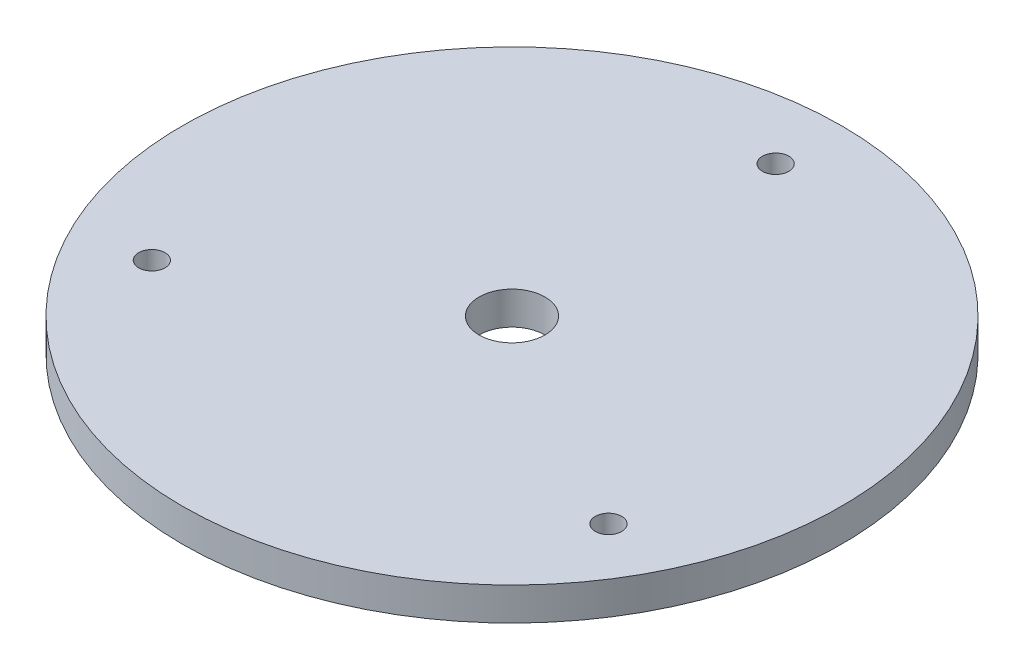
ISO-10303-21;
HEADER;
FILE_DESCRIPTION(('STEP AP214'),'2;1');
FILE_NAME('part.step','',(''),(''),'','','');
FILE_SCHEMA(('AUTOMOTIVE_DESIGN { 1 0 10303 214 1 1 1 1 }'));
ENDSEC;
DATA;
#1=APPLICATION_CONTEXT('core data for automotive mechanical design processes');
#2=APPLICATION_PROTOCOL_DEFINITION('international standard','automotive_design',2000,#1);
#3=PRODUCT_CONTEXT('',#1,'mechanical');
#4=PRODUCT('Part','Part','',(#3));
#5=PRODUCT_RELATED_PRODUCT_CATEGORY('part','',(#4));
#6=PRODUCT_DEFINITION_FORMATION('','',#4);
#7=PRODUCT_DEFINITION_CONTEXT('part definition',#1,'design');
#8=PRODUCT_DEFINITION('design','',#6,#7);
#9=PRODUCT_DEFINITION_SHAPE('','',#8);
#10=(LENGTH_UNIT() NAMED_UNIT(*) SI_UNIT(.MILLI.,.METRE.));
#11=(NAMED_UNIT(*) PLANE_ANGLE_UNIT() SI_UNIT($,.RADIAN.));
#12=(NAMED_UNIT(*) SI_UNIT($,.STERADIAN.) SOLID_ANGLE_UNIT());
#13=UNCERTAINTY_MEASURE_WITH_UNIT(LENGTH_MEASURE(1.E-05),#10,'distance_accuracy_value','');
#14=(GEOMETRIC_REPRESENTATION_CONTEXT(3) GLOBAL_UNCERTAINTY_ASSIGNED_CONTEXT((#13)) GLOBAL_UNIT_ASSIGNED_CONTEXT((#10,
#11,#12)) REPRESENTATION_CONTEXT('',''));
#15=CARTESIAN_POINT('',(0.,0.,0.));
#16=DIRECTION('',(0.,0.,1.));
#17=DIRECTION('',(1.,0.,0.));
#18=AXIS2_PLACEMENT_3D('',#15,#16,#17);
#19=CARTESIAN_POINT('',(0.,10.,0.));
#20=DIRECTION('',(0.,1.,0.));
#21=DIRECTION('',(0.,0.,1.));
#22=AXIS2_PLACEMENT_3D('',#19,#20,#21);
#23=PLANE('',#22);
#24=CARTESIAN_POINT('',(69.2820323027549,10.,40.0000000000003));
#25=DIRECTION('',(0.,1.,0.));
#26=DIRECTION('',(0.,0.,1.));
#27=AXIS2_PLACEMENT_3D('',#24,#25,#26);
#28=CIRCLE('',#27,4.00000000000001);
#29=CARTESIAN_POINT('',(69.2820323027549,10.,44.0000000000003));
#30=VERTEX_POINT('',#29);
#31=EDGE_CURVE('E56',#30,#30,#28,.T.);
#32=ORIENTED_EDGE('',*,*,#31,.F.);
#33=EDGE_LOOP('',(#32));
#34=FACE_BOUND('',#33,.T.);
#35=CARTESIAN_POINT('',(0.,10.,0.));
#36=DIRECTION('',(0.,1.,0.));
#37=DIRECTION('',(0.,0.,1.));
#38=AXIS2_PLACEMENT_3D('',#35,#36,#37);
#39=CIRCLE('',#38,10.);
#40=CARTESIAN_POINT('',(0.,10.,10.));
#41=VERTEX_POINT('',#40);
#42=EDGE_CURVE('E45',#41,#41,#39,.T.);
#43=ORIENTED_EDGE('',*,*,#42,.F.);
#44=EDGE_LOOP('',(#43));
#45=FACE_BOUND('',#44,.T.);
#46=CARTESIAN_POINT('',(0.,10.,0.));
#47=DIRECTION('',(0.,1.,0.));
#48=DIRECTION('',(0.,0.,1.));
#49=AXIS2_PLACEMENT_3D('',#46,#47,#48);
#50=CIRCLE('',#49,100.);
#51=CARTESIAN_POINT('',(0.,10.,100.));
#52=VERTEX_POINT('',#51);
#53=EDGE_CURVE('E10',#52,#52,#50,.T.);
#54=ORIENTED_EDGE('',*,*,#53,.T.);
#55=EDGE_LOOP('',(#54));
#56=FACE_BOUND('',#55,.T.);
#57=CARTESIAN_POINT('',(-69.2820323027552,10.,39.9999999999998));
#58=DIRECTION('',(0.,1.,0.));
#59=DIRECTION('',(0.,0.,1.));
#60=AXIS2_PLACEMENT_3D('',#57,#58,#59);
#61=CIRCLE('',#60,4.);
#62=CARTESIAN_POINT('',(-69.2820323027552,10.,43.9999999999998));
#63=VERTEX_POINT('',#62);
#64=EDGE_CURVE('E50',#63,#63,#61,.T.);
#65=ORIENTED_EDGE('',*,*,#64,.F.);
#66=EDGE_LOOP('',(#65));
#67=FACE_BOUND('',#66,.T.);
#68=CARTESIAN_POINT('',(0.,10.,-80.));
#69=DIRECTION('',(0.,1.,0.));
#70=DIRECTION('',(0.,0.,1.));
#71=AXIS2_PLACEMENT_3D('',#68,#69,#70);
#72=CIRCLE('',#71,4.);
#73=CARTESIAN_POINT('',(0.,10.,-76.));
#74=VERTEX_POINT('',#73);
#75=EDGE_CURVE('E62',#74,#74,#72,.T.);
#76=ORIENTED_EDGE('',*,*,#75,.F.);
#77=EDGE_LOOP('',(#76));
#78=FACE_BOUND('',#77,.T.);
#79=ADVANCED_FACE('F34',(#34,#45,#56,#67,#78),#23,.T.);
#80=CARTESIAN_POINT('',(0.,0.,0.));
#81=DIRECTION('',(0.,1.,0.));
#82=DIRECTION('',(0.,0.,1.));
#83=AXIS2_PLACEMENT_3D('',#80,#81,#82);
#84=PLANE('',#83);
#85=CARTESIAN_POINT('',(69.2820323027549,0.,40.0000000000003));
#86=DIRECTION('',(0.,1.,0.));
#87=DIRECTION('',(0.,0.,1.));
#88=AXIS2_PLACEMENT_3D('',#85,#86,#87);
#89=CIRCLE('',#88,4.00000000000001);
#90=CARTESIAN_POINT('',(69.2820323027549,0.,44.0000000000003));
#91=VERTEX_POINT('',#90);
#92=EDGE_CURVE('E59',#91,#91,#89,.T.);
#93=ORIENTED_EDGE('',*,*,#92,.T.);
#94=EDGE_LOOP('',(#93));
#95=FACE_BOUND('',#94,.T.);
#96=CARTESIAN_POINT('',(0.,0.,0.));
#97=DIRECTION('',(0.,1.,0.));
#98=DIRECTION('',(0.,0.,1.));
#99=AXIS2_PLACEMENT_3D('',#96,#97,#98);
#100=CIRCLE('',#99,10.);
#101=CARTESIAN_POINT('',(0.,0.,10.));
#102=VERTEX_POINT('',#101);
#103=EDGE_CURVE('E47',#102,#102,#100,.T.);
#104=ORIENTED_EDGE('',*,*,#103,.T.);
#105=EDGE_LOOP('',(#104));
#106=FACE_BOUND('',#105,.T.);
#107=CARTESIAN_POINT('',(0.,0.,0.));
#108=DIRECTION('',(0.,1.,0.));
#109=DIRECTION('',(0.,0.,1.));
#110=AXIS2_PLACEMENT_3D('',#107,#108,#109);
#111=CIRCLE('',#110,100.);
#112=CARTESIAN_POINT('',(0.,0.,100.));
#113=VERTEX_POINT('',#112);
#114=EDGE_CURVE('E38',#113,#113,#111,.T.);
#115=ORIENTED_EDGE('',*,*,#114,.F.);
#116=EDGE_LOOP('',(#115));
#117=FACE_BOUND('',#116,.T.);
#118=CARTESIAN_POINT('',(-69.2820323027552,0.,39.9999999999998));
#119=DIRECTION('',(0.,1.,0.));
#120=DIRECTION('',(0.,0.,1.));
#121=AXIS2_PLACEMENT_3D('',#118,#119,#120);
#122=CIRCLE('',#121,4.);
#123=CARTESIAN_POINT('',(-69.2820323027552,0.,43.9999999999998));
#124=VERTEX_POINT('',#123);
#125=EDGE_CURVE('E53',#124,#124,#122,.T.);
#126=ORIENTED_EDGE('',*,*,#125,.T.);
#127=EDGE_LOOP('',(#126));
#128=FACE_BOUND('',#127,.T.);
#129=CARTESIAN_POINT('',(0.,0.,-80.));
#130=DIRECTION('',(0.,1.,0.));
#131=DIRECTION('',(0.,0.,1.));
#132=AXIS2_PLACEMENT_3D('',#129,#130,#131);
#133=CIRCLE('',#132,4.);
#134=CARTESIAN_POINT('',(0.,0.,-76.));
#135=VERTEX_POINT('',#134);
#136=EDGE_CURVE('E65',#135,#135,#133,.T.);
#137=ORIENTED_EDGE('',*,*,#136,.T.);
#138=EDGE_LOOP('',(#137));
#139=FACE_BOUND('',#138,.T.);
#140=ADVANCED_FACE('F75',(#95,#106,#117,#128,#139),#84,.F.);
#141=CARTESIAN_POINT('',(0.,10.,0.));
#142=DIRECTION('',(0.,-1.,0.));
#143=DIRECTION('',(0.,0.,-1.));
#144=AXIS2_PLACEMENT_3D('',#141,#142,#143);
#145=CYLINDRICAL_SURFACE('',#144,100.);
#146=ORIENTED_EDGE('',*,*,#53,.F.);
#147=EDGE_LOOP('',(#146));
#148=FACE_BOUND('',#147,.T.);
#149=ORIENTED_EDGE('',*,*,#114,.T.);
#150=EDGE_LOOP('',(#149));
#151=FACE_BOUND('',#150,.T.);
#152=ADVANCED_FACE('F36',(#148,#151),#145,.T.);
#153=CARTESIAN_POINT('',(0.,10.,0.));
#154=DIRECTION('',(0.,-1.,0.));
#155=DIRECTION('',(0.,0.,-1.));
#156=AXIS2_PLACEMENT_3D('',#153,#154,#155);
#157=CYLINDRICAL_SURFACE('',#156,10.);
#158=ORIENTED_EDGE('',*,*,#42,.T.);
#159=EDGE_LOOP('',(#158));
#160=FACE_BOUND('',#159,.T.);
#161=ORIENTED_EDGE('',*,*,#103,.F.);
#162=EDGE_LOOP('',(#161));
#163=FACE_BOUND('',#162,.T.);
#164=ADVANCED_FACE('F85',(#160,#163),#157,.F.);
#165=CARTESIAN_POINT('',(-69.2820323027552,10.,39.9999999999998));
#166=DIRECTION('',(0.,-1.,0.));
#167=DIRECTION('',(0.,0.,-1.));
#168=AXIS2_PLACEMENT_3D('',#165,#166,#167);
#169=CYLINDRICAL_SURFACE('',#168,4.);
#170=ORIENTED_EDGE('',*,*,#64,.T.);
#171=EDGE_LOOP('',(#170));
#172=FACE_BOUND('',#171,.T.);
#173=ORIENTED_EDGE('',*,*,#125,.F.);
#174=EDGE_LOOP('',(#173));
#175=FACE_BOUND('',#174,.T.);
#176=ADVANCED_FACE('F88',(#172,#175),#169,.F.);
#177=CARTESIAN_POINT('',(69.2820323027549,10.,40.0000000000003));
#178=DIRECTION('',(0.,-1.,0.));
#179=DIRECTION('',(0.,0.,-1.));
#180=AXIS2_PLACEMENT_3D('',#177,#178,#179);
#181=CYLINDRICAL_SURFACE('',#180,4.00000000000001);
#182=ORIENTED_EDGE('',*,*,#31,.T.);
#183=EDGE_LOOP('',(#182));
#184=FACE_BOUND('',#183,.T.);
#185=ORIENTED_EDGE('',*,*,#92,.F.);
#186=EDGE_LOOP('',(#185));
#187=FACE_BOUND('',#186,.T.);
#188=ADVANCED_FACE('F92',(#184,#187),#181,.F.);
#189=CARTESIAN_POINT('',(0.,10.,-80.));
#190=DIRECTION('',(0.,-1.,0.));
#191=DIRECTION('',(0.,0.,-1.));
#192=AXIS2_PLACEMENT_3D('',#189,#190,#191);
#193=CYLINDRICAL_SURFACE('',#192,4.);
#194=ORIENTED_EDGE('',*,*,#75,.T.);
#195=EDGE_LOOP('',(#194));
#196=FACE_BOUND('',#195,.T.);
#197=ORIENTED_EDGE('',*,*,#136,.F.);
#198=EDGE_LOOP('',(#197));
#199=FACE_BOUND('',#198,.T.);
#200=ADVANCED_FACE('F71',(#196,#199),#193,.F.);
#201=CLOSED_SHELL('',(#79,#140,#152,#164,#176,#188,#200));
#202=MANIFOLD_SOLID_BREP('B2',#201);
#203=ADVANCED_BREP_SHAPE_REPRESENTATION('',(#18,#202),#14);
#204=SHAPE_DEFINITION_REPRESENTATION(#9,#203);
ENDSEC;
END-ISO-10303-21;
